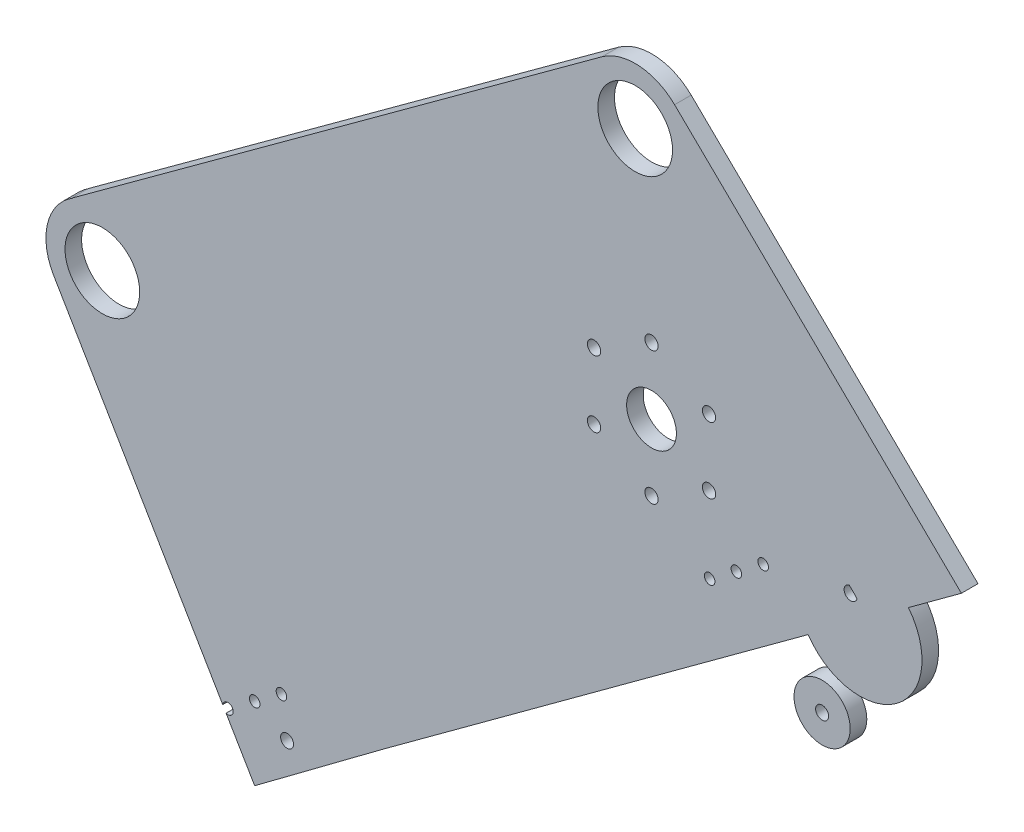
ISO-10303-21;
HEADER;
FILE_DESCRIPTION(('STEP AP214'),'2;1');
FILE_NAME('part.step','',(''),(''),'','','');
FILE_SCHEMA(('AUTOMOTIVE_DESIGN { 1 0 10303 214 1 1 1 1 }'));
ENDSEC;
DATA;
#1=APPLICATION_CONTEXT('core data for automotive mechanical design processes');
#2=APPLICATION_PROTOCOL_DEFINITION('international standard','automotive_design',2000,#1);
#3=PRODUCT_CONTEXT('',#1,'mechanical');
#4=PRODUCT('Part','Part','',(#3));
#5=PRODUCT_RELATED_PRODUCT_CATEGORY('part','',(#4));
#6=PRODUCT_DEFINITION_FORMATION('','',#4);
#7=PRODUCT_DEFINITION_CONTEXT('part definition',#1,'design');
#8=PRODUCT_DEFINITION('design','',#6,#7);
#9=PRODUCT_DEFINITION_SHAPE('','',#8);
#10=(LENGTH_UNIT() NAMED_UNIT(*) SI_UNIT(.MILLI.,.METRE.));
#11=(NAMED_UNIT(*) PLANE_ANGLE_UNIT() SI_UNIT($,.RADIAN.));
#12=(NAMED_UNIT(*) SI_UNIT($,.STERADIAN.) SOLID_ANGLE_UNIT());
#13=UNCERTAINTY_MEASURE_WITH_UNIT(LENGTH_MEASURE(1.E-05),#10,'distance_accuracy_value','');
#14=(GEOMETRIC_REPRESENTATION_CONTEXT(3) GLOBAL_UNCERTAINTY_ASSIGNED_CONTEXT((#13)) GLOBAL_UNIT_ASSIGNED_CONTEXT((#10,
#11,#12)) REPRESENTATION_CONTEXT('',''));
#15=CARTESIAN_POINT('',(0.,0.,0.));
#16=DIRECTION('',(0.,0.,1.));
#17=DIRECTION('',(1.,0.,0.));
#18=AXIS2_PLACEMENT_3D('',#15,#16,#17);
#19=CARTESIAN_POINT('',(-58.0145942928494,79.1007973614675,6.35));
#20=DIRECTION('',(0.591412339888863,-0.80636929767147,0.));
#21=DIRECTION('',(0.806369297671471,0.591412339888863,0.));
#22=AXIS2_PLACEMENT_3D('',#19,#20,#21);
#23=PLANE('',#22);
#24=DIRECTION('',(-0.80636929767147,-0.591412339888863,0.));
#25=VECTOR('',#24,1.);
#26=CARTESIAN_POINT('',(-58.0145942928494,79.1007973614675,0.));
#27=LINE('',#26,#25);
#28=CARTESIAN_POINT('',(175.044488559568,250.032426231912,0.));
#29=VERTEX_POINT('',#28);
#30=CARTESIAN_POINT('',(12.5971113726992,130.889269705091,0.));
#31=VERTEX_POINT('',#30);
#32=EDGE_CURVE('E13',#29,#31,#27,.T.);
#33=ORIENTED_EDGE('',*,*,#32,.F.);
#34=DIRECTION('',(0.,0.,-1.));
#35=VECTOR('',#34,1.);
#36=CARTESIAN_POINT('',(175.044488559568,250.032426231912,6.35));
#37=LINE('',#36,#35);
#38=CARTESIAN_POINT('',(175.044488559568,250.032426231912,6.35));
#39=VERTEX_POINT('',#38);
#40=EDGE_CURVE('E265',#39,#29,#37,.T.);
#41=ORIENTED_EDGE('',*,*,#40,.F.);
#42=DIRECTION('',(-0.80636929767147,-0.591412339888863,0.));
#43=VECTOR('',#42,1.);
#44=CARTESIAN_POINT('',(-58.0145942928494,79.1007973614675,6.35));
#45=LINE('',#44,#43);
#46=CARTESIAN_POINT('',(12.5971113726992,130.889269705091,6.35));
#47=VERTEX_POINT('',#46);
#48=EDGE_CURVE('E143',#39,#47,#45,.T.);
#49=ORIENTED_EDGE('',*,*,#48,.T.);
#50=DIRECTION('',(0.,0.,-1.));
#51=VECTOR('',#50,1.);
#52=CARTESIAN_POINT('',(12.5971113726992,130.889269705091,6.35));
#53=LINE('',#52,#51);
#54=EDGE_CURVE('E294',#47,#31,#53,.T.);
#55=ORIENTED_EDGE('',*,*,#54,.T.);
#56=EDGE_LOOP('',(#33,#41,#49,#55));
#57=FACE_BOUND('',#56,.T.);
#58=ADVANCED_FACE('F139',(#57),#23,.T.);
#59=CARTESIAN_POINT('',(194.801692658245,263.33217195702,6.35));
#60=DIRECTION('',(0.,0.,-1.));
#61=DIRECTION('',(-1.,0.,0.));
#62=AXIS2_PLACEMENT_3D('',#59,#60,#61);
#63=CYLINDRICAL_SURFACE('',#62,23.8165982069088);
#64=CARTESIAN_POINT('',(194.801692658245,263.33217195702,0.));
#65=DIRECTION('',(0.,0.,1.));
#66=DIRECTION('',(1.,0.,0.));
#67=AXIS2_PLACEMENT_3D('',#64,#65,#66);
#68=CIRCLE('',#67,23.8165982069088);
#69=CARTESIAN_POINT('',(213.423210377577,278.180384912724,0.));
#70=VERTEX_POINT('',#69);
#71=EDGE_CURVE('E148',#29,#70,#68,.T.);
#72=ORIENTED_EDGE('',*,*,#71,.T.);
#73=DIRECTION('',(0.,0.,-1.));
#74=VECTOR('',#73,1.);
#75=CARTESIAN_POINT('',(213.423210377577,278.180384912724,6.35));
#76=LINE('',#75,#74);
#77=CARTESIAN_POINT('',(213.423210377577,278.180384912724,6.35));
#78=VERTEX_POINT('',#77);
#79=EDGE_CURVE('E267',#78,#70,#76,.T.);
#80=ORIENTED_EDGE('',*,*,#79,.F.);
#81=CARTESIAN_POINT('',(194.801692658245,263.33217195702,6.35));
#82=DIRECTION('',(0.,0.,1.));
#83=DIRECTION('',(1.,0.,0.));
#84=AXIS2_PLACEMENT_3D('',#81,#82,#83);
#85=CIRCLE('',#84,23.8165982069088);
#86=EDGE_CURVE('E434',#39,#78,#85,.T.);
#87=ORIENTED_EDGE('',*,*,#86,.F.);
#88=ORIENTED_EDGE('',*,*,#40,.T.);
#89=EDGE_LOOP('',(#72,#80,#87,#88));
#90=FACE_BOUND('',#89,.T.);
#91=ADVANCED_FACE('F496',(#90),#63,.T.);
#92=CARTESIAN_POINT('',(233.695993468112,293.048974426554,0.));
#93=VERTEX_POINT('',#92);
#94=EDGE_CURVE('E150',#93,#70,#27,.T.);
#95=ORIENTED_EDGE('',*,*,#94,.F.);
#96=DIRECTION('',(0.,0.,-1.));
#97=VECTOR('',#96,1.);
#98=CARTESIAN_POINT('',(233.695993468112,293.048974426554,6.35));
#99=LINE('',#98,#97);
#100=CARTESIAN_POINT('',(233.695993468112,293.048974426554,6.35));
#101=VERTEX_POINT('',#100);
#102=EDGE_CURVE('E269',#101,#93,#99,.T.);
#103=ORIENTED_EDGE('',*,*,#102,.F.);
#104=EDGE_CURVE('E433',#101,#78,#45,.T.);
#105=ORIENTED_EDGE('',*,*,#104,.T.);
#106=ORIENTED_EDGE('',*,*,#79,.T.);
#107=EDGE_LOOP('',(#95,#103,#105,#106));
#108=FACE_BOUND('',#107,.T.);
#109=ADVANCED_FACE('F443',(#108),#23,.T.);
#110=CARTESIAN_POINT('',(260.40904857053,266.99483248331,6.35));
#111=DIRECTION('',(0.698222581301587,0.715880735151148,0.));
#112=DIRECTION('',(-0.715880735151148,0.698222581301587,0.));
#113=AXIS2_PLACEMENT_3D('',#110,#111,#112);
#114=PLANE('',#113);
#115=DIRECTION('',(0.715880735151148,-0.698222581301587,0.));
#116=VECTOR('',#115,1.);
#117=CARTESIAN_POINT('',(260.40904857053,266.99483248331,0.));
#118=LINE('',#117,#116);
#119=CARTESIAN_POINT('',(123.939892902666,400.097794275326,0.));
#120=VERTEX_POINT('',#119);
#121=EDGE_CURVE('E363',#120,#93,#118,.T.);
#122=ORIENTED_EDGE('',*,*,#121,.F.);
#123=DIRECTION('',(0.,0.,-1.));
#124=VECTOR('',#123,1.);
#125=CARTESIAN_POINT('',(123.939892902666,400.097794275326,6.35));
#126=LINE('',#125,#124);
#127=CARTESIAN_POINT('',(123.939892902666,400.097794275326,6.35));
#128=VERTEX_POINT('',#127);
#129=EDGE_CURVE('E271',#128,#120,#126,.T.);
#130=ORIENTED_EDGE('',*,*,#129,.F.);
#131=DIRECTION('',(0.715880735151148,-0.698222581301587,0.));
#132=VECTOR('',#131,1.);
#133=CARTESIAN_POINT('',(260.40904857053,266.99483248331,6.35));
#134=LINE('',#133,#132);
#135=EDGE_CURVE('E431',#128,#101,#134,.T.);
#136=ORIENTED_EDGE('',*,*,#135,.T.);
#137=ORIENTED_EDGE('',*,*,#102,.T.);
#138=EDGE_LOOP('',(#122,#130,#136,#137));
#139=FACE_BOUND('',#138,.T.);
#140=ADVANCED_FACE('F448',(#139),#114,.T.);
#141=CARTESIAN_POINT('',(108.865267372365,384.641929203413,6.35));
#142=DIRECTION('',(0.,0.,-1.));
#143=DIRECTION('',(-1.,0.,0.));
#144=AXIS2_PLACEMENT_3D('',#141,#142,#143);
#145=CYLINDRICAL_SURFACE('',#144,21.5899999999999);
#146=CARTESIAN_POINT('',(108.865267372365,384.641929203413,0.));
#147=DIRECTION('',(0.,0.,1.));
#148=DIRECTION('',(1.,0.,0.));
#149=AXIS2_PLACEMENT_3D('',#146,#147,#148);
#150=CIRCLE('',#149,21.5899999999999);
#151=CARTESIAN_POINT('',(96.1250627386689,402.072227132351,0.));
#152=VERTEX_POINT('',#151);
#153=EDGE_CURVE('E361',#120,#152,#150,.T.);
#154=ORIENTED_EDGE('',*,*,#153,.T.);
#155=DIRECTION('',(0.,0.,-1.));
#156=VECTOR('',#155,1.);
#157=CARTESIAN_POINT('',(96.1250627386689,402.072227132351,6.35));
#158=LINE('',#157,#156);
#159=CARTESIAN_POINT('',(96.1250627386689,402.072227132351,6.35));
#160=VERTEX_POINT('',#159);
#161=EDGE_CURVE('E273',#160,#152,#158,.T.);
#162=ORIENTED_EDGE('',*,*,#161,.F.);
#163=CARTESIAN_POINT('',(108.865267372365,384.641929203413,6.35));
#164=DIRECTION('',(0.,0.,1.));
#165=DIRECTION('',(1.,0.,0.));
#166=AXIS2_PLACEMENT_3D('',#163,#164,#165);
#167=CIRCLE('',#166,21.5899999999999);
#168=EDGE_CURVE('E429',#128,#160,#167,.T.);
#169=ORIENTED_EDGE('',*,*,#168,.F.);
#170=ORIENTED_EDGE('',*,*,#129,.T.);
#171=EDGE_LOOP('',(#154,#162,#169,#170));
#172=FACE_BOUND('',#171,.T.);
#173=ADVANCED_FACE('F453',(#172),#145,.T.);
#174=CARTESIAN_POINT('',(-158.076858744562,216.270210943149,6.35));
#175=DIRECTION('',(0.590097481875696,-0.807332002266702,0.));
#176=DIRECTION('',(0.807332002266702,0.590097481875696,0.));
#177=AXIS2_PLACEMENT_3D('',#174,#175,#176);
#178=PLANE('',#177);
#179=DIRECTION('',(-0.807332002266702,-0.590097481875696,0.));
#180=VECTOR('',#179,1.);
#181=CARTESIAN_POINT('',(-158.076858744562,216.270210943149,0.));
#182=LINE('',#181,#180);
#183=CARTESIAN_POINT('',(-106.905210068869,253.672742915342,0.));
#184=VERTEX_POINT('',#183);
#185=EDGE_CURVE('E359',#152,#184,#182,.T.);
#186=ORIENTED_EDGE('',*,*,#185,.T.);
#187=DIRECTION('',(0.,0.,-1.));
#188=VECTOR('',#187,1.);
#189=CARTESIAN_POINT('',(-106.905210068869,253.672742915342,6.35));
#190=LINE('',#189,#188);
#191=CARTESIAN_POINT('',(-106.905210068869,253.672742915342,6.35));
#192=VERTEX_POINT('',#191);
#193=EDGE_CURVE('E276',#192,#184,#190,.T.);
#194=ORIENTED_EDGE('',*,*,#193,.F.);
#195=DIRECTION('',(-0.807332002266702,-0.590097481875696,0.));
#196=VECTOR('',#195,1.);
#197=CARTESIAN_POINT('',(-158.076858744562,216.270210943149,6.35));
#198=LINE('',#197,#196);
#199=EDGE_CURVE('E427',#160,#192,#198,.T.);
#200=ORIENTED_EDGE('',*,*,#199,.F.);
#201=ORIENTED_EDGE('',*,*,#161,.T.);
#202=EDGE_LOOP('',(#186,#194,#200,#201));
#203=FACE_BOUND('',#202,.T.);
#204=ADVANCED_FACE('F459',(#203),#178,.F.);
#205=CARTESIAN_POINT('',(-138.221651335503,235.274625310833,6.35));
#206=DIRECTION('',(-0.506543079409337,0.862214653495581,0.));
#207=DIRECTION('',(-0.862214653495582,-0.506543079409337,0.));
#208=AXIS2_PLACEMENT_3D('',#205,#206,#207);
#209=PLANE('',#208);
#210=DIRECTION('',(0.862214653495582,0.506543079409337,0.));
#211=VECTOR('',#210,1.);
#212=CARTESIAN_POINT('',(-138.221651335503,235.274625310833,0.));
#213=LINE('',#212,#211);
#214=CARTESIAN_POINT('',(-105.973590034164,254.220061009863,0.));
#215=VERTEX_POINT('',#214);
#216=EDGE_CURVE('E357',#184,#215,#213,.T.);
#217=ORIENTED_EDGE('',*,*,#216,.T.);
#218=DIRECTION('',(0.,0.,-1.));
#219=VECTOR('',#218,1.);
#220=CARTESIAN_POINT('',(-105.973590034164,254.220061009863,6.35));
#221=LINE('',#220,#219);
#222=CARTESIAN_POINT('',(-105.973590034164,254.220061009863,6.35));
#223=VERTEX_POINT('',#222);
#224=EDGE_CURVE('E279',#223,#215,#221,.T.);
#225=ORIENTED_EDGE('',*,*,#224,.F.);
#226=DIRECTION('',(0.862214653495582,0.506543079409337,0.));
#227=VECTOR('',#226,1.);
#228=CARTESIAN_POINT('',(-138.221651335503,235.274625310833,6.35));
#229=LINE('',#228,#227);
#230=EDGE_CURVE('E425',#192,#223,#229,.T.);
#231=ORIENTED_EDGE('',*,*,#230,.F.);
#232=ORIENTED_EDGE('',*,*,#193,.T.);
#233=EDGE_LOOP('',(#217,#225,#231,#232));
#234=FACE_BOUND('',#233,.T.);
#235=ADVANCED_FACE('F463',(#234),#209,.F.);
#236=CARTESIAN_POINT('',(-95.037324949716,235.604846640893,6.35));
#237=DIRECTION('',(0.,0.,-1.));
#238=DIRECTION('',(-1.,0.,0.));
#239=AXIS2_PLACEMENT_3D('',#236,#237,#238);
#240=CYLINDRICAL_SURFACE('',#239,21.59);
#241=CARTESIAN_POINT('',(-95.037324949716,235.604846640893,0.));
#242=DIRECTION('',(0.,0.,1.));
#243=DIRECTION('',(1.,0.,0.));
#244=AXIS2_PLACEMENT_3D('',#241,#242,#243);
#245=CIRCLE('',#244,21.59);
#246=CARTESIAN_POINT('',(-113.642415099352,224.651366804607,0.));
#247=VERTEX_POINT('',#246);
#248=EDGE_CURVE('E355',#215,#247,#245,.T.);
#249=ORIENTED_EDGE('',*,*,#248,.T.);
#250=DIRECTION('',(0.,0.,-1.));
#251=VECTOR('',#250,1.);
#252=CARTESIAN_POINT('',(-113.642415099352,224.651366804607,6.35));
#253=LINE('',#252,#251);
#254=CARTESIAN_POINT('',(-113.642415099352,224.651366804607,6.35));
#255=VERTEX_POINT('',#254);
#256=EDGE_CURVE('E282',#255,#247,#253,.T.);
#257=ORIENTED_EDGE('',*,*,#256,.F.);
#258=CARTESIAN_POINT('',(-95.037324949716,235.604846640893,6.35));
#259=DIRECTION('',(0.,0.,1.));
#260=DIRECTION('',(1.,0.,0.));
#261=AXIS2_PLACEMENT_3D('',#258,#259,#260);
#262=CIRCLE('',#261,21.59);
#263=EDGE_CURVE('E423',#223,#255,#262,.T.);
#264=ORIENTED_EDGE('',*,*,#263,.F.);
#265=ORIENTED_EDGE('',*,*,#224,.T.);
#266=EDGE_LOOP('',(#249,#257,#264,#265));
#267=FACE_BOUND('',#266,.T.);
#268=ADVANCED_FACE('F468',(#267),#240,.T.);
#269=CARTESIAN_POINT('',(13.825723790201,8.13969647768593,6.35));
#270=DIRECTION('',(0.861745722539881,0.507340427803875,0.));
#271=DIRECTION('',(-0.507340427803875,0.861745722539881,0.));
#272=AXIS2_PLACEMENT_3D('',#269,#270,#271);
#273=PLANE('',#272);
#274=DIRECTION('',(0.507340427803875,-0.861745722539881,0.));
#275=VECTOR('',#274,1.);
#276=CARTESIAN_POINT('',(13.825723790201,8.13969647768593,0.));
#277=LINE('',#276,#275);
#278=CARTESIAN_POINT('',(-48.9802173461725,114.819054475318,0.));
#279=VERTEX_POINT('',#278);
#280=EDGE_CURVE('E352',#247,#279,#277,.T.);
#281=ORIENTED_EDGE('',*,*,#280,.T.);
#282=DIRECTION('',(0.,0.,-1.));
#283=VECTOR('',#282,1.);
#284=CARTESIAN_POINT('',(-48.9802173461725,114.819054475318,6.35));
#285=LINE('',#284,#283);
#286=CARTESIAN_POINT('',(-48.9802173461725,114.819054475318,6.35));
#287=VERTEX_POINT('',#286);
#288=EDGE_CURVE('E285',#287,#279,#285,.T.);
#289=ORIENTED_EDGE('',*,*,#288,.F.);
#290=DIRECTION('',(0.507340427803875,-0.861745722539881,0.));
#291=VECTOR('',#290,1.);
#292=CARTESIAN_POINT('',(13.825723790201,8.13969647768593,6.35));
#293=LINE('',#292,#291);
#294=EDGE_CURVE('E421',#255,#287,#293,.T.);
#295=ORIENTED_EDGE('',*,*,#294,.F.);
#296=ORIENTED_EDGE('',*,*,#256,.T.);
#297=EDGE_LOOP('',(#281,#289,#295,#296));
#298=FACE_BOUND('',#297,.T.);
#299=ADVANCED_FACE('F473',(#298),#273,.F.);
#300=CARTESIAN_POINT('',(-46.9839153268576,114.515161833616,6.35));
#301=DIRECTION('',(0.,0.,-1.));
#302=DIRECTION('',(-1.,0.,0.));
#303=AXIS2_PLACEMENT_3D('',#300,#301,#302);
#304=CYLINDRICAL_SURFACE('',#303,2.01930000000035);
#305=CARTESIAN_POINT('',(-46.9839153268576,114.515161833616,0.));
#306=DIRECTION('',(0.,0.,1.));
#307=DIRECTION('',(1.,0.,0.));
#308=AXIS2_PLACEMENT_3D('',#305,#306,#307);
#309=CIRCLE('',#308,2.01930000000035);
#310=CARTESIAN_POINT('',(-47.6868210059015,112.622149394046,0.));
#311=VERTEX_POINT('',#310);
#312=EDGE_CURVE('E349',#311,#279,#309,.T.);
#313=ORIENTED_EDGE('',*,*,#312,.F.);
#314=DIRECTION('',(0.,0.,-1.));
#315=VECTOR('',#314,1.);
#316=CARTESIAN_POINT('',(-47.6868210059015,112.622149394046,6.35));
#317=LINE('',#316,#315);
#318=CARTESIAN_POINT('',(-47.6868210059015,112.622149394046,6.35));
#319=VERTEX_POINT('',#318);
#320=EDGE_CURVE('E287',#319,#311,#317,.T.);
#321=ORIENTED_EDGE('',*,*,#320,.F.);
#322=CARTESIAN_POINT('',(-46.9839153268576,114.515161833616,6.35));
#323=DIRECTION('',(0.,0.,1.));
#324=DIRECTION('',(1.,0.,0.));
#325=AXIS2_PLACEMENT_3D('',#322,#323,#324);
#326=CIRCLE('',#325,2.01930000000035);
#327=EDGE_CURVE('E418',#319,#287,#326,.T.);
#328=ORIENTED_EDGE('',*,*,#327,.T.);
#329=ORIENTED_EDGE('',*,*,#288,.T.);
#330=EDGE_LOOP('',(#313,#321,#328,#329));
#331=FACE_BOUND('',#330,.T.);
#332=ADVANCED_FACE('F477',(#331),#304,.F.);
#333=CARTESIAN_POINT('',(-36.7497037716635,94.0448520272265,0.));
#334=VERTEX_POINT('',#333);
#335=EDGE_CURVE('E348',#311,#334,#277,.T.);
#336=ORIENTED_EDGE('',*,*,#335,.T.);
#337=DIRECTION('',(0.,0.,-1.));
#338=VECTOR('',#337,1.);
#339=CARTESIAN_POINT('',(-36.7497037716635,94.0448520272265,6.35));
#340=LINE('',#339,#338);
#341=CARTESIAN_POINT('',(-36.7497037716635,94.0448520272265,6.35));
#342=VERTEX_POINT('',#341);
#343=EDGE_CURVE('E289',#342,#334,#340,.T.);
#344=ORIENTED_EDGE('',*,*,#343,.F.);
#345=EDGE_CURVE('E417',#319,#342,#293,.T.);
#346=ORIENTED_EDGE('',*,*,#345,.F.);
#347=ORIENTED_EDGE('',*,*,#320,.T.);
#348=EDGE_LOOP('',(#336,#344,#346,#347));
#349=FACE_BOUND('',#348,.T.);
#350=ADVANCED_FACE('F482',(#349),#273,.F.);
#351=CARTESIAN_POINT('',(-58.2396300255187,77.9989202294783,6.35));
#352=DIRECTION('',(-0.59829210989985,0.801278073599662,0.));
#353=DIRECTION('',(-0.801278073599662,-0.59829210989985,0.));
#354=AXIS2_PLACEMENT_3D('',#351,#352,#353);
#355=PLANE('',#354);
#356=DIRECTION('',(0.801278073599662,0.59829210989985,0.));
#357=VECTOR('',#356,1.);
#358=CARTESIAN_POINT('',(-58.2396300255187,77.9989202294783,0.));
#359=LINE('',#358,#357);
#360=CARTESIAN_POINT('',(12.3743100208932,130.724390413525,0.));
#361=VERTEX_POINT('',#360);
#362=EDGE_CURVE('E345',#334,#361,#359,.T.);
#363=ORIENTED_EDGE('',*,*,#362,.T.);
#364=DIRECTION('',(0.,0.,-1.));
#365=VECTOR('',#364,1.);
#366=CARTESIAN_POINT('',(12.3743100208932,130.724390413525,6.35));
#367=LINE('',#366,#365);
#368=CARTESIAN_POINT('',(12.3743100208932,130.724390413525,6.35));
#369=VERTEX_POINT('',#368);
#370=EDGE_CURVE('E292',#369,#361,#367,.T.);
#371=ORIENTED_EDGE('',*,*,#370,.F.);
#372=DIRECTION('',(0.801278073599662,0.59829210989985,0.));
#373=VECTOR('',#372,1.);
#374=CARTESIAN_POINT('',(-58.2396300255187,77.9989202294783,6.35));
#375=LINE('',#374,#373);
#376=EDGE_CURVE('E415',#342,#369,#375,.T.);
#377=ORIENTED_EDGE('',*,*,#376,.F.);
#378=ORIENTED_EDGE('',*,*,#343,.T.);
#379=EDGE_LOOP('',(#363,#371,#377,#378));
#380=FACE_BOUND('',#379,.T.);
#381=ADVANCED_FACE('F487',(#380),#355,.F.);
#382=CARTESIAN_POINT('',(-95.037324949716,235.604846640893,6.35));
#383=DIRECTION('',(0.,0.,-1.));
#384=DIRECTION('',(-1.,0.,0.));
#385=AXIS2_PLACEMENT_3D('',#382,#383,#384);
#386=CYLINDRICAL_SURFACE('',#385,14.2874999999999);
#387=CARTESIAN_POINT('',(-95.037324949716,235.604846640893,6.35));
#388=DIRECTION('',(0.,0.,1.));
#389=DIRECTION('',(1.,0.,0.));
#390=AXIS2_PLACEMENT_3D('',#387,#388,#389);
#391=CIRCLE('',#390,14.2874999999999);
#392=CARTESIAN_POINT('',(-80.7498249497161,235.604846640893,6.35));
#393=VERTEX_POINT('',#392);
#394=EDGE_CURVE('E370',#393,#393,#391,.T.);
#395=ORIENTED_EDGE('',*,*,#394,.T.);
#396=EDGE_LOOP('',(#395));
#397=FACE_BOUND('',#396,.T.);
#398=CARTESIAN_POINT('',(-95.037324949716,235.604846640893,0.));
#399=DIRECTION('',(0.,0.,1.));
#400=DIRECTION('',(1.,0.,0.));
#401=AXIS2_PLACEMENT_3D('',#398,#399,#400);
#402=CIRCLE('',#401,14.2874999999999);
#403=CARTESIAN_POINT('',(-80.7498249497161,235.604846640893,0.));
#404=VERTEX_POINT('',#403);
#405=EDGE_CURVE('E300',#404,#404,#402,.T.);
#406=ORIENTED_EDGE('',*,*,#405,.F.);
#407=EDGE_LOOP('',(#406));
#408=FACE_BOUND('',#407,.T.);
#409=ADVANCED_FACE('F571',(#397,#408),#386,.F.);
#410=CARTESIAN_POINT('',(-24.3503664231861,115.175606008639,6.35));
#411=DIRECTION('',(0.,0.,-1.));
#412=DIRECTION('',(-1.,0.,0.));
#413=AXIS2_PLACEMENT_3D('',#410,#411,#412);
#414=CYLINDRICAL_SURFACE('',#413,2.4892);
#415=CARTESIAN_POINT('',(-24.3503664231861,115.175606008639,6.35));
#416=DIRECTION('',(0.,0.,1.));
#417=DIRECTION('',(1.,0.,0.));
#418=AXIS2_PLACEMENT_3D('',#415,#416,#417);
#419=CIRCLE('',#418,2.4892);
#420=CARTESIAN_POINT('',(-21.8611664231861,115.175606008639,6.35));
#421=VERTEX_POINT('',#420);
#422=EDGE_CURVE('E373',#421,#421,#419,.T.);
#423=ORIENTED_EDGE('',*,*,#422,.T.);
#424=EDGE_LOOP('',(#423));
#425=FACE_BOUND('',#424,.T.);
#426=CARTESIAN_POINT('',(-24.3503664231861,115.175606008639,0.));
#427=DIRECTION('',(0.,0.,1.));
#428=DIRECTION('',(1.,0.,0.));
#429=AXIS2_PLACEMENT_3D('',#426,#427,#428);
#430=CIRCLE('',#429,2.4892);
#431=CARTESIAN_POINT('',(-21.8611664231861,115.175606008639,0.));
#432=VERTEX_POINT('',#431);
#433=EDGE_CURVE('E303',#432,#432,#430,.T.);
#434=ORIENTED_EDGE('',*,*,#433,.F.);
#435=EDGE_LOOP('',(#434));
#436=FACE_BOUND('',#435,.T.);
#437=ADVANCED_FACE('F619',(#425,#436),#414,.F.);
#438=CARTESIAN_POINT('',(157.833886281696,264.733896165387,6.35));
#439=DIRECTION('',(0.,0.,-1.));
#440=DIRECTION('',(-1.,0.,0.));
#441=AXIS2_PLACEMENT_3D('',#438,#439,#440);
#442=CYLINDRICAL_SURFACE('',#441,2.01929999999998);
#443=CARTESIAN_POINT('',(157.833886281696,264.733896165387,6.35));
#444=DIRECTION('',(0.,0.,1.));
#445=DIRECTION('',(1.,0.,0.));
#446=AXIS2_PLACEMENT_3D('',#443,#444,#445);
#447=CIRCLE('',#446,2.01929999999998);
#448=CARTESIAN_POINT('',(159.853186281696,264.733896165387,6.35));
#449=VERTEX_POINT('',#448);
#450=EDGE_CURVE('E376',#449,#449,#447,.T.);
#451=ORIENTED_EDGE('',*,*,#450,.T.);
#452=EDGE_LOOP('',(#451));
#453=FACE_BOUND('',#452,.T.);
#454=CARTESIAN_POINT('',(157.833886281696,264.733896165387,0.));
#455=DIRECTION('',(0.,0.,1.));
#456=DIRECTION('',(1.,0.,0.));
#457=AXIS2_PLACEMENT_3D('',#454,#455,#456);
#458=CIRCLE('',#457,2.01929999999998);
#459=CARTESIAN_POINT('',(159.853186281696,264.733896165387,0.));
#460=VERTEX_POINT('',#459);
#461=EDGE_CURVE('E306',#460,#460,#458,.T.);
#462=ORIENTED_EDGE('',*,*,#461,.F.);
#463=EDGE_LOOP('',(#462));
#464=FACE_BOUND('',#463,.T.);
#465=ADVANCED_FACE('F615',(#453,#464),#442,.F.);
#466=CARTESIAN_POINT('',(147.592996201268,257.222959448799,6.35));
#467=DIRECTION('',(0.,0.,-1.));
#468=DIRECTION('',(-1.,0.,0.));
#469=AXIS2_PLACEMENT_3D('',#466,#467,#468);
#470=CYLINDRICAL_SURFACE('',#469,2.01929999999982);
#471=CARTESIAN_POINT('',(147.592996201268,257.222959448799,6.35));
#472=DIRECTION('',(0.,0.,1.));
#473=DIRECTION('',(1.,0.,0.));
#474=AXIS2_PLACEMENT_3D('',#471,#472,#473);
#475=CIRCLE('',#474,2.01929999999982);
#476=CARTESIAN_POINT('',(149.612296201268,257.222959448799,6.35));
#477=VERTEX_POINT('',#476);
#478=EDGE_CURVE('E379',#477,#477,#475,.T.);
#479=ORIENTED_EDGE('',*,*,#478,.T.);
#480=EDGE_LOOP('',(#479));
#481=FACE_BOUND('',#480,.T.);
#482=CARTESIAN_POINT('',(147.592996201268,257.222959448799,0.));
#483=DIRECTION('',(0.,0.,1.));
#484=DIRECTION('',(1.,0.,0.));
#485=AXIS2_PLACEMENT_3D('',#482,#483,#484);
#486=CIRCLE('',#485,2.01929999999982);
#487=CARTESIAN_POINT('',(149.612296201268,257.222959448799,0.));
#488=VERTEX_POINT('',#487);
#489=EDGE_CURVE('E309',#488,#488,#486,.T.);
#490=ORIENTED_EDGE('',*,*,#489,.F.);
#491=EDGE_LOOP('',(#490));
#492=FACE_BOUND('',#491,.T.);
#493=ADVANCED_FACE('F611',(#481,#492),#470,.F.);
#494=CARTESIAN_POINT('',(137.352106120841,249.71202273221,6.35));
#495=DIRECTION('',(0.,0.,-1.));
#496=DIRECTION('',(-1.,0.,0.));
#497=AXIS2_PLACEMENT_3D('',#494,#495,#496);
#498=CYLINDRICAL_SURFACE('',#497,2.01929999999972);
#499=CARTESIAN_POINT('',(137.352106120841,249.71202273221,6.35));
#500=DIRECTION('',(0.,0.,1.));
#501=DIRECTION('',(1.,0.,0.));
#502=AXIS2_PLACEMENT_3D('',#499,#500,#501);
#503=CIRCLE('',#502,2.01929999999972);
#504=CARTESIAN_POINT('',(139.37140612084,249.71202273221,6.35));
#505=VERTEX_POINT('',#504);
#506=EDGE_CURVE('E382',#505,#505,#503,.T.);
#507=ORIENTED_EDGE('',*,*,#506,.T.);
#508=EDGE_LOOP('',(#507));
#509=FACE_BOUND('',#508,.T.);
#510=CARTESIAN_POINT('',(137.352106120841,249.71202273221,0.));
#511=DIRECTION('',(0.,0.,1.));
#512=DIRECTION('',(1.,0.,0.));
#513=AXIS2_PLACEMENT_3D('',#510,#511,#512);
#514=CIRCLE('',#513,2.01929999999972);
#515=CARTESIAN_POINT('',(139.37140612084,249.71202273221,0.));
#516=VERTEX_POINT('',#515);
#517=EDGE_CURVE('E312',#516,#516,#514,.T.);
#518=ORIENTED_EDGE('',*,*,#517,.F.);
#519=EDGE_LOOP('',(#518));
#520=FACE_BOUND('',#519,.T.);
#521=ADVANCED_FACE('F607',(#509,#520),#498,.F.);
#522=CARTESIAN_POINT('',(-26.5021351660023,129.537035266793,6.35));
#523=DIRECTION('',(0.,0.,-1.));
#524=DIRECTION('',(-1.,0.,0.));
#525=AXIS2_PLACEMENT_3D('',#522,#523,#524);
#526=CYLINDRICAL_SURFACE('',#525,2.01930000000003);
#527=CARTESIAN_POINT('',(-26.5021351660023,129.537035266793,6.35));
#528=DIRECTION('',(0.,0.,1.));
#529=DIRECTION('',(1.,0.,0.));
#530=AXIS2_PLACEMENT_3D('',#527,#528,#529);
#531=CIRCLE('',#530,2.01930000000003);
#532=CARTESIAN_POINT('',(-24.4828351660022,129.537035266793,6.35));
#533=VERTEX_POINT('',#532);
#534=EDGE_CURVE('E385',#533,#533,#531,.T.);
#535=ORIENTED_EDGE('',*,*,#534,.T.);
#536=EDGE_LOOP('',(#535));
#537=FACE_BOUND('',#536,.T.);
#538=CARTESIAN_POINT('',(-26.5021351660023,129.537035266793,0.));
#539=DIRECTION('',(0.,0.,1.));
#540=DIRECTION('',(1.,0.,0.));
#541=AXIS2_PLACEMENT_3D('',#538,#539,#540);
#542=CIRCLE('',#541,2.01930000000003);
#543=CARTESIAN_POINT('',(-24.4828351660022,129.537035266793,0.));
#544=VERTEX_POINT('',#543);
#545=EDGE_CURVE('E315',#544,#544,#542,.T.);
#546=ORIENTED_EDGE('',*,*,#545,.F.);
#547=EDGE_LOOP('',(#546));
#548=FACE_BOUND('',#547,.T.);
#549=ADVANCED_FACE('F603',(#537,#548),#526,.F.);
#550=CARTESIAN_POINT('',(-36.7430252464299,122.026098550205,6.35));
#551=DIRECTION('',(0.,0.,-1.));
#552=DIRECTION('',(-1.,0.,0.));
#553=AXIS2_PLACEMENT_3D('',#550,#551,#552);
#554=CYLINDRICAL_SURFACE('',#553,2.01930000000035);
#555=CARTESIAN_POINT('',(-36.7430252464299,122.026098550205,6.35));
#556=DIRECTION('',(0.,0.,1.));
#557=DIRECTION('',(1.,0.,0.));
#558=AXIS2_PLACEMENT_3D('',#555,#556,#557);
#559=CIRCLE('',#558,2.01930000000035);
#560=CARTESIAN_POINT('',(-34.7237252464296,122.026098550205,6.35));
#561=VERTEX_POINT('',#560);
#562=EDGE_CURVE('E388',#561,#561,#559,.T.);
#563=ORIENTED_EDGE('',*,*,#562,.T.);
#564=EDGE_LOOP('',(#563));
#565=FACE_BOUND('',#564,.T.);
#566=CARTESIAN_POINT('',(-36.7430252464299,122.026098550205,0.));
#567=DIRECTION('',(0.,0.,1.));
#568=DIRECTION('',(1.,0.,0.));
#569=AXIS2_PLACEMENT_3D('',#566,#567,#568);
#570=CIRCLE('',#569,2.01930000000035);
#571=CARTESIAN_POINT('',(-34.7237252464296,122.026098550205,0.));
#572=VERTEX_POINT('',#571);
#573=EDGE_CURVE('E318',#572,#572,#570,.T.);
#574=ORIENTED_EDGE('',*,*,#573,.F.);
#575=EDGE_LOOP('',(#574));
#576=FACE_BOUND('',#575,.T.);
#577=ADVANCED_FACE('F599',(#565,#576),#554,.F.);
#578=CARTESIAN_POINT('',(115.109334590485,316.863814510386,6.35));
#579=DIRECTION('',(0.,0.,-1.));
#580=DIRECTION('',(-1.,0.,0.));
#581=AXIS2_PLACEMENT_3D('',#578,#579,#580);
#582=CYLINDRICAL_SURFACE('',#581,2.53999999999998);
#583=CARTESIAN_POINT('',(115.109334590485,316.863814510386,6.35));
#584=DIRECTION('',(0.,0.,1.));
#585=DIRECTION('',(1.,0.,0.));
#586=AXIS2_PLACEMENT_3D('',#583,#584,#585);
#587=CIRCLE('',#586,2.53999999999998);
#588=CARTESIAN_POINT('',(117.649334590485,316.863814510386,6.35));
#589=VERTEX_POINT('',#588);
#590=EDGE_CURVE('E391',#589,#589,#587,.T.);
#591=ORIENTED_EDGE('',*,*,#590,.T.);
#592=EDGE_LOOP('',(#591));
#593=FACE_BOUND('',#592,.T.);
#594=CARTESIAN_POINT('',(115.109334590485,316.863814510386,0.));
#595=DIRECTION('',(0.,0.,1.));
#596=DIRECTION('',(1.,0.,0.));
#597=AXIS2_PLACEMENT_3D('',#594,#595,#596);
#598=CIRCLE('',#597,2.53999999999998);
#599=CARTESIAN_POINT('',(117.649334590485,316.863814510386,0.));
#600=VERTEX_POINT('',#599);
#601=EDGE_CURVE('E321',#600,#600,#598,.T.);
#602=ORIENTED_EDGE('',*,*,#601,.F.);
#603=EDGE_LOOP('',(#602));
#604=FACE_BOUND('',#603,.T.);
#605=ADVANCED_FACE('F595',(#593,#604),#582,.F.);
#606=CARTESIAN_POINT('',(137.10637984661,304.163814510385,6.35));
#607=DIRECTION('',(0.,0.,-1.));
#608=DIRECTION('',(-1.,0.,0.));
#609=AXIS2_PLACEMENT_3D('',#606,#607,#608);
#610=CYLINDRICAL_SURFACE('',#609,2.53999999999998);
#611=CARTESIAN_POINT('',(137.10637984661,304.163814510385,6.35));
#612=DIRECTION('',(0.,0.,1.));
#613=DIRECTION('',(1.,0.,0.));
#614=AXIS2_PLACEMENT_3D('',#611,#612,#613);
#615=CIRCLE('',#614,2.53999999999998);
#616=CARTESIAN_POINT('',(139.64637984661,304.163814510385,6.35));
#617=VERTEX_POINT('',#616);
#618=EDGE_CURVE('E394',#617,#617,#615,.T.);
#619=ORIENTED_EDGE('',*,*,#618,.T.);
#620=EDGE_LOOP('',(#619));
#621=FACE_BOUND('',#620,.T.);
#622=CARTESIAN_POINT('',(137.10637984661,304.163814510385,0.));
#623=DIRECTION('',(0.,0.,1.));
#624=DIRECTION('',(1.,0.,0.));
#625=AXIS2_PLACEMENT_3D('',#622,#623,#624);
#626=CIRCLE('',#625,2.53999999999998);
#627=CARTESIAN_POINT('',(139.64637984661,304.163814510385,0.));
#628=VERTEX_POINT('',#627);
#629=EDGE_CURVE('E324',#628,#628,#626,.T.);
#630=ORIENTED_EDGE('',*,*,#629,.F.);
#631=EDGE_LOOP('',(#630));
#632=FACE_BOUND('',#631,.T.);
#633=ADVANCED_FACE('F591',(#621,#632),#610,.F.);
#634=CARTESIAN_POINT('',(137.106379846609,278.763814510386,6.35));
#635=DIRECTION('',(0.,0.,-1.));
#636=DIRECTION('',(-1.,0.,0.));
#637=AXIS2_PLACEMENT_3D('',#634,#635,#636);
#638=CYLINDRICAL_SURFACE('',#637,2.53999999999996);
#639=CARTESIAN_POINT('',(137.106379846609,278.763814510386,6.35));
#640=DIRECTION('',(0.,0.,1.));
#641=DIRECTION('',(1.,0.,0.));
#642=AXIS2_PLACEMENT_3D('',#639,#640,#641);
#643=CIRCLE('',#642,2.53999999999996);
#644=CARTESIAN_POINT('',(139.646379846609,278.763814510386,6.35));
#645=VERTEX_POINT('',#644);
#646=EDGE_CURVE('E397',#645,#645,#643,.T.);
#647=ORIENTED_EDGE('',*,*,#646,.T.);
#648=EDGE_LOOP('',(#647));
#649=FACE_BOUND('',#648,.T.);
#650=CARTESIAN_POINT('',(137.106379846609,278.763814510386,0.));
#651=DIRECTION('',(0.,0.,1.));
#652=DIRECTION('',(1.,0.,0.));
#653=AXIS2_PLACEMENT_3D('',#650,#651,#652);
#654=CIRCLE('',#653,2.53999999999996);
#655=CARTESIAN_POINT('',(139.646379846609,278.763814510386,0.));
#656=VERTEX_POINT('',#655);
#657=EDGE_CURVE('E327',#656,#656,#654,.T.);
#658=ORIENTED_EDGE('',*,*,#657,.F.);
#659=EDGE_LOOP('',(#658));
#660=FACE_BOUND('',#659,.T.);
#661=ADVANCED_FACE('F587',(#649,#660),#638,.F.);
#662=CARTESIAN_POINT('',(115.109334590484,266.063814510386,6.35));
#663=DIRECTION('',(0.,0.,-1.));
#664=DIRECTION('',(-1.,0.,0.));
#665=AXIS2_PLACEMENT_3D('',#662,#663,#664);
#666=CYLINDRICAL_SURFACE('',#665,2.54000000000001);
#667=CARTESIAN_POINT('',(115.109334590484,266.063814510386,6.35));
#668=DIRECTION('',(0.,0.,1.));
#669=DIRECTION('',(1.,0.,0.));
#670=AXIS2_PLACEMENT_3D('',#667,#668,#669);
#671=CIRCLE('',#670,2.54000000000001);
#672=CARTESIAN_POINT('',(117.649334590484,266.063814510386,6.35));
#673=VERTEX_POINT('',#672);
#674=EDGE_CURVE('E400',#673,#673,#671,.T.);
#675=ORIENTED_EDGE('',*,*,#674,.T.);
#676=EDGE_LOOP('',(#675));
#677=FACE_BOUND('',#676,.T.);
#678=CARTESIAN_POINT('',(115.109334590484,266.063814510386,0.));
#679=DIRECTION('',(0.,0.,1.));
#680=DIRECTION('',(1.,0.,0.));
#681=AXIS2_PLACEMENT_3D('',#678,#679,#680);
#682=CIRCLE('',#681,2.54000000000001);
#683=CARTESIAN_POINT('',(117.649334590484,266.063814510386,0.));
#684=VERTEX_POINT('',#683);
#685=EDGE_CURVE('E330',#684,#684,#682,.T.);
#686=ORIENTED_EDGE('',*,*,#685,.F.);
#687=EDGE_LOOP('',(#686));
#688=FACE_BOUND('',#687,.T.);
#689=ADVANCED_FACE('F583',(#677,#688),#666,.F.);
#690=CARTESIAN_POINT('',(93.1122893343601,278.763814510386,6.35));
#691=DIRECTION('',(0.,0.,-1.));
#692=DIRECTION('',(-1.,0.,0.));
#693=AXIS2_PLACEMENT_3D('',#690,#691,#692);
#694=CYLINDRICAL_SURFACE('',#693,2.53999999999997);
#695=CARTESIAN_POINT('',(93.1122893343601,278.763814510386,6.35));
#696=DIRECTION('',(0.,0.,1.));
#697=DIRECTION('',(1.,0.,0.));
#698=AXIS2_PLACEMENT_3D('',#695,#696,#697);
#699=CIRCLE('',#698,2.53999999999997);
#700=CARTESIAN_POINT('',(95.65228933436,278.763814510386,6.35));
#701=VERTEX_POINT('',#700);
#702=EDGE_CURVE('E403',#701,#701,#699,.T.);
#703=ORIENTED_EDGE('',*,*,#702,.T.);
#704=EDGE_LOOP('',(#703));
#705=FACE_BOUND('',#704,.T.);
#706=CARTESIAN_POINT('',(93.1122893343601,278.763814510386,0.));
#707=DIRECTION('',(0.,0.,1.));
#708=DIRECTION('',(1.,0.,0.));
#709=AXIS2_PLACEMENT_3D('',#706,#707,#708);
#710=CIRCLE('',#709,2.53999999999997);
#711=CARTESIAN_POINT('',(95.65228933436,278.763814510386,0.));
#712=VERTEX_POINT('',#711);
#713=EDGE_CURVE('E333',#712,#712,#710,.T.);
#714=ORIENTED_EDGE('',*,*,#713,.F.);
#715=EDGE_LOOP('',(#714));
#716=FACE_BOUND('',#715,.T.);
#717=ADVANCED_FACE('F579',(#705,#716),#694,.F.);
#718=CARTESIAN_POINT('',(93.1122893343606,304.163814510386,6.35));
#719=DIRECTION('',(0.,0.,-1.));
#720=DIRECTION('',(-1.,0.,0.));
#721=AXIS2_PLACEMENT_3D('',#718,#719,#720);
#722=CYLINDRICAL_SURFACE('',#721,2.53999999999994);
#723=CARTESIAN_POINT('',(93.1122893343606,304.163814510386,6.35));
#724=DIRECTION('',(0.,0.,1.));
#725=DIRECTION('',(1.,0.,0.));
#726=AXIS2_PLACEMENT_3D('',#723,#724,#725);
#727=CIRCLE('',#726,2.53999999999994);
#728=CARTESIAN_POINT('',(95.6522893343605,304.163814510386,6.35));
#729=VERTEX_POINT('',#728);
#730=EDGE_CURVE('E406',#729,#729,#727,.T.);
#731=ORIENTED_EDGE('',*,*,#730,.T.);
#732=EDGE_LOOP('',(#731));
#733=FACE_BOUND('',#732,.T.);
#734=CARTESIAN_POINT('',(93.1122893343606,304.163814510386,0.));
#735=DIRECTION('',(0.,0.,1.));
#736=DIRECTION('',(1.,0.,0.));
#737=AXIS2_PLACEMENT_3D('',#734,#735,#736);
#738=CIRCLE('',#737,2.53999999999994);
#739=CARTESIAN_POINT('',(95.6522893343605,304.163814510386,0.));
#740=VERTEX_POINT('',#739);
#741=EDGE_CURVE('E336',#740,#740,#738,.T.);
#742=ORIENTED_EDGE('',*,*,#741,.F.);
#743=EDGE_LOOP('',(#742));
#744=FACE_BOUND('',#743,.T.);
#745=ADVANCED_FACE('F575',(#733,#744),#722,.F.);
#746=CARTESIAN_POINT('',(115.109334590485,291.463814510386,6.35));
#747=DIRECTION('',(0.,0.,-1.));
#748=DIRECTION('',(-1.,0.,0.));
#749=AXIS2_PLACEMENT_3D('',#746,#747,#748);
#750=CYLINDRICAL_SURFACE('',#749,9.52499999999999);
#751=CARTESIAN_POINT('',(115.109334590485,291.463814510386,6.35));
#752=DIRECTION('',(0.,0.,1.));
#753=DIRECTION('',(1.,0.,0.));
#754=AXIS2_PLACEMENT_3D('',#751,#752,#753);
#755=CIRCLE('',#754,9.52499999999999);
#756=CARTESIAN_POINT('',(124.634334590485,291.463814510386,6.35));
#757=VERTEX_POINT('',#756);
#758=EDGE_CURVE('E409',#757,#757,#755,.T.);
#759=ORIENTED_EDGE('',*,*,#758,.T.);
#760=EDGE_LOOP('',(#759));
#761=FACE_BOUND('',#760,.T.);
#762=CARTESIAN_POINT('',(115.109334590485,291.463814510386,0.));
#763=DIRECTION('',(0.,0.,1.));
#764=DIRECTION('',(1.,0.,0.));
#765=AXIS2_PLACEMENT_3D('',#762,#763,#764);
#766=CIRCLE('',#765,9.52499999999999);
#767=CARTESIAN_POINT('',(124.634334590485,291.463814510386,0.));
#768=VERTEX_POINT('',#767);
#769=EDGE_CURVE('E339',#768,#768,#766,.T.);
#770=ORIENTED_EDGE('',*,*,#769,.F.);
#771=EDGE_LOOP('',(#770));
#772=FACE_BOUND('',#771,.T.);
#773=ADVANCED_FACE('F541',(#761,#772),#750,.F.);
#774=CARTESIAN_POINT('',(31.75,104.775,6.35));
#775=DIRECTION('',(0.,0.,-1.));
#776=DIRECTION('',(-1.,0.,0.));
#777=AXIS2_PLACEMENT_3D('',#774,#775,#776);
#778=CYLINDRICAL_SURFACE('',#777,32.385);
#779=CARTESIAN_POINT('',(31.75,104.775,0.));
#780=DIRECTION('',(0.,0.,1.));
#781=DIRECTION('',(1.,0.,0.));
#782=AXIS2_PLACEMENT_3D('',#779,#780,#781);
#783=CIRCLE('',#782,32.385);
#784=EDGE_CURVE('E342',#31,#361,#783,.T.);
#785=ORIENTED_EDGE('',*,*,#784,.F.);
#786=ORIENTED_EDGE('',*,*,#54,.F.);
#787=CARTESIAN_POINT('',(31.75,104.775,6.35));
#788=DIRECTION('',(0.,0.,1.));
#789=DIRECTION('',(1.,0.,0.));
#790=AXIS2_PLACEMENT_3D('',#787,#788,#789);
#791=CIRCLE('',#790,32.385);
#792=EDGE_CURVE('E412',#47,#369,#791,.T.);
#793=ORIENTED_EDGE('',*,*,#792,.T.);
#794=ORIENTED_EDGE('',*,*,#370,.T.);
#795=EDGE_LOOP('',(#785,#786,#793,#794));
#796=FACE_BOUND('',#795,.T.);
#797=ADVANCED_FACE('F491',(#796),#778,.F.);
#798=CARTESIAN_POINT('',(108.865267372365,384.641929203413,6.35));
#799=DIRECTION('',(0.,0.,-1.));
#800=DIRECTION('',(-1.,0.,0.));
#801=AXIS2_PLACEMENT_3D('',#798,#799,#800);
#802=CYLINDRICAL_SURFACE('',#801,14.2874999999999);
#803=CARTESIAN_POINT('',(108.865267372365,384.641929203413,6.35));
#804=DIRECTION('',(0.,0.,1.));
#805=DIRECTION('',(1.,0.,0.));
#806=AXIS2_PLACEMENT_3D('',#803,#804,#805);
#807=CIRCLE('',#806,14.2874999999999);
#808=CARTESIAN_POINT('',(123.152767372365,384.641929203413,6.35));
#809=VERTEX_POINT('',#808);
#810=EDGE_CURVE('E296',#809,#809,#807,.T.);
#811=ORIENTED_EDGE('',*,*,#810,.T.);
#812=EDGE_LOOP('',(#811));
#813=FACE_BOUND('',#812,.T.);
#814=CARTESIAN_POINT('',(108.865267372365,384.641929203413,0.));
#815=DIRECTION('',(0.,0.,1.));
#816=DIRECTION('',(1.,0.,0.));
#817=AXIS2_PLACEMENT_3D('',#814,#815,#816);
#818=CIRCLE('',#817,14.2874999999999);
#819=CARTESIAN_POINT('',(123.152767372365,384.641929203413,0.));
#820=VERTEX_POINT('',#819);
#821=EDGE_CURVE('E297',#820,#820,#818,.T.);
#822=ORIENTED_EDGE('',*,*,#821,.F.);
#823=EDGE_LOOP('',(#822));
#824=FACE_BOUND('',#823,.T.);
#825=ADVANCED_FACE('F533',(#813,#824),#802,.F.);
#826=CARTESIAN_POINT('',(0.,0.,6.35));
#827=DIRECTION('',(0.,0.,1.));
#828=DIRECTION('',(1.,0.,0.));
#829=AXIS2_PLACEMENT_3D('',#826,#827,#828);
#830=PLANE('',#829);
#831=CARTESIAN_POINT('',(191.3018855904,271.857648486755,6.35));
#832=DIRECTION('',(0.,0.,1.));
#833=DIRECTION('',(1.,0.,0.));
#834=AXIS2_PLACEMENT_3D('',#831,#832,#833);
#835=CIRCLE('',#834,2.48920000000001);
#836=CARTESIAN_POINT('',(190.76194237846,274.287582224098,6.35));
#837=VERTEX_POINT('',#836);
#838=CARTESIAN_POINT('',(193.721643788509,271.273793279803,6.35));
#839=VERTEX_POINT('',#838);
#840=EDGE_CURVE('E248',#837,#839,#835,.T.);
#841=ORIENTED_EDGE('',*,*,#840,.F.);
#842=CARTESIAN_POINT('',(165.1,246.126,6.35));
#843=DIRECTION('',(0.,0.,1.));
#844=DIRECTION('',(1.,0.,0.));
#845=AXIS2_PLACEMENT_3D('',#842,#843,#844);
#846=CIRCLE('',#845,38.1000000000001);
#847=EDGE_CURVE('E254',#839,#837,#846,.T.);
#848=ORIENTED_EDGE('',*,*,#847,.F.);
#849=EDGE_LOOP('',(#841,#848));
#850=FACE_BOUND('',#849,.T.);
#851=ORIENTED_EDGE('',*,*,#48,.F.);
#852=ORIENTED_EDGE('',*,*,#86,.T.);
#853=ORIENTED_EDGE('',*,*,#104,.F.);
#854=ORIENTED_EDGE('',*,*,#135,.F.);
#855=ORIENTED_EDGE('',*,*,#168,.T.);
#856=ORIENTED_EDGE('',*,*,#199,.T.);
#857=ORIENTED_EDGE('',*,*,#230,.T.);
#858=ORIENTED_EDGE('',*,*,#263,.T.);
#859=ORIENTED_EDGE('',*,*,#294,.T.);
#860=ORIENTED_EDGE('',*,*,#327,.F.);
#861=ORIENTED_EDGE('',*,*,#345,.T.);
#862=ORIENTED_EDGE('',*,*,#376,.T.);
#863=ORIENTED_EDGE('',*,*,#792,.F.);
#864=EDGE_LOOP('',(#851,#852,#853,#854,#855,#856,#857,#858,#859,#860,#861,#862,#863));
#865=FACE_BOUND('',#864,.T.);
#866=ORIENTED_EDGE('',*,*,#758,.F.);
#867=EDGE_LOOP('',(#866));
#868=FACE_BOUND('',#867,.T.);
#869=ORIENTED_EDGE('',*,*,#730,.F.);
#870=EDGE_LOOP('',(#869));
#871=FACE_BOUND('',#870,.T.);
#872=ORIENTED_EDGE('',*,*,#702,.F.);
#873=EDGE_LOOP('',(#872));
#874=FACE_BOUND('',#873,.T.);
#875=ORIENTED_EDGE('',*,*,#674,.F.);
#876=EDGE_LOOP('',(#875));
#877=FACE_BOUND('',#876,.T.);
#878=ORIENTED_EDGE('',*,*,#646,.F.);
#879=EDGE_LOOP('',(#878));
#880=FACE_BOUND('',#879,.T.);
#881=ORIENTED_EDGE('',*,*,#618,.F.);
#882=EDGE_LOOP('',(#881));
#883=FACE_BOUND('',#882,.T.);
#884=ORIENTED_EDGE('',*,*,#590,.F.);
#885=EDGE_LOOP('',(#884));
#886=FACE_BOUND('',#885,.T.);
#887=ORIENTED_EDGE('',*,*,#562,.F.);
#888=EDGE_LOOP('',(#887));
#889=FACE_BOUND('',#888,.T.);
#890=ORIENTED_EDGE('',*,*,#534,.F.);
#891=EDGE_LOOP('',(#890));
#892=FACE_BOUND('',#891,.T.);
#893=ORIENTED_EDGE('',*,*,#506,.F.);
#894=EDGE_LOOP('',(#893));
#895=FACE_BOUND('',#894,.T.);
#896=ORIENTED_EDGE('',*,*,#478,.F.);
#897=EDGE_LOOP('',(#896));
#898=FACE_BOUND('',#897,.T.);
#899=ORIENTED_EDGE('',*,*,#450,.F.);
#900=EDGE_LOOP('',(#899));
#901=FACE_BOUND('',#900,.T.);
#902=ORIENTED_EDGE('',*,*,#422,.F.);
#903=EDGE_LOOP('',(#902));
#904=FACE_BOUND('',#903,.T.);
#905=ORIENTED_EDGE('',*,*,#394,.F.);
#906=EDGE_LOOP('',(#905));
#907=FACE_BOUND('',#906,.T.);
#908=ORIENTED_EDGE('',*,*,#810,.F.);
#909=EDGE_LOOP('',(#908));
#910=FACE_BOUND('',#909,.T.);
#911=ADVANCED_FACE('F141',(#850,#865,#868,#871,#874,#877,#880,#883,#886,#889,#892,#895,#898,
#901,#904,#907,#910),#830,.T.);
#912=CARTESIAN_POINT('',(0.,0.,0.));
#913=DIRECTION('',(0.,0.,1.));
#914=DIRECTION('',(1.,0.,0.));
#915=AXIS2_PLACEMENT_3D('',#912,#913,#914);
#916=PLANE('',#915);
#917=CARTESIAN_POINT('',(165.1,246.126,0.));
#918=DIRECTION('',(0.,0.,1.));
#919=DIRECTION('',(1.,0.,0.));
#920=AXIS2_PLACEMENT_3D('',#917,#918,#919);
#921=CIRCLE('',#920,38.1000000000001);
#922=CARTESIAN_POINT('',(193.721643788509,271.273793279803,0.));
#923=VERTEX_POINT('',#922);
#924=CARTESIAN_POINT('',(190.76194237846,274.287582224098,0.));
#925=VERTEX_POINT('',#924);
#926=EDGE_CURVE('E164',#923,#925,#921,.T.);
#927=ORIENTED_EDGE('',*,*,#926,.T.);
#928=CARTESIAN_POINT('',(191.3018855904,271.857648486755,0.));
#929=DIRECTION('',(0.,0.,1.));
#930=DIRECTION('',(1.,0.,0.));
#931=AXIS2_PLACEMENT_3D('',#928,#929,#930);
#932=CIRCLE('',#931,2.48920000000001);
#933=EDGE_CURVE('E259',#925,#923,#932,.T.);
#934=ORIENTED_EDGE('',*,*,#933,.T.);
#935=EDGE_LOOP('',(#927,#934));
#936=FACE_BOUND('',#935,.T.);
#937=ORIENTED_EDGE('',*,*,#32,.T.);
#938=ORIENTED_EDGE('',*,*,#784,.T.);
#939=ORIENTED_EDGE('',*,*,#362,.F.);
#940=ORIENTED_EDGE('',*,*,#335,.F.);
#941=ORIENTED_EDGE('',*,*,#312,.T.);
#942=ORIENTED_EDGE('',*,*,#280,.F.);
#943=ORIENTED_EDGE('',*,*,#248,.F.);
#944=ORIENTED_EDGE('',*,*,#216,.F.);
#945=ORIENTED_EDGE('',*,*,#185,.F.);
#946=ORIENTED_EDGE('',*,*,#153,.F.);
#947=ORIENTED_EDGE('',*,*,#121,.T.);
#948=ORIENTED_EDGE('',*,*,#94,.T.);
#949=ORIENTED_EDGE('',*,*,#71,.F.);
#950=EDGE_LOOP('',(#937,#938,#939,#940,#941,#942,#943,#944,#945,#946,#947,#948,#949));
#951=FACE_BOUND('',#950,.T.);
#952=ORIENTED_EDGE('',*,*,#769,.T.);
#953=EDGE_LOOP('',(#952));
#954=FACE_BOUND('',#953,.T.);
#955=ORIENTED_EDGE('',*,*,#741,.T.);
#956=EDGE_LOOP('',(#955));
#957=FACE_BOUND('',#956,.T.);
#958=ORIENTED_EDGE('',*,*,#713,.T.);
#959=EDGE_LOOP('',(#958));
#960=FACE_BOUND('',#959,.T.);
#961=ORIENTED_EDGE('',*,*,#685,.T.);
#962=EDGE_LOOP('',(#961));
#963=FACE_BOUND('',#962,.T.);
#964=ORIENTED_EDGE('',*,*,#657,.T.);
#965=EDGE_LOOP('',(#964));
#966=FACE_BOUND('',#965,.T.);
#967=ORIENTED_EDGE('',*,*,#629,.T.);
#968=EDGE_LOOP('',(#967));
#969=FACE_BOUND('',#968,.T.);
#970=ORIENTED_EDGE('',*,*,#601,.T.);
#971=EDGE_LOOP('',(#970));
#972=FACE_BOUND('',#971,.T.);
#973=ORIENTED_EDGE('',*,*,#573,.T.);
#974=EDGE_LOOP('',(#973));
#975=FACE_BOUND('',#974,.T.);
#976=ORIENTED_EDGE('',*,*,#545,.T.);
#977=EDGE_LOOP('',(#976));
#978=FACE_BOUND('',#977,.T.);
#979=ORIENTED_EDGE('',*,*,#517,.T.);
#980=EDGE_LOOP('',(#979));
#981=FACE_BOUND('',#980,.T.);
#982=ORIENTED_EDGE('',*,*,#489,.T.);
#983=EDGE_LOOP('',(#982));
#984=FACE_BOUND('',#983,.T.);
#985=ORIENTED_EDGE('',*,*,#461,.T.);
#986=EDGE_LOOP('',(#985));
#987=FACE_BOUND('',#986,.T.);
#988=ORIENTED_EDGE('',*,*,#433,.T.);
#989=EDGE_LOOP('',(#988));
#990=FACE_BOUND('',#989,.T.);
#991=ORIENTED_EDGE('',*,*,#405,.T.);
#992=EDGE_LOOP('',(#991));
#993=FACE_BOUND('',#992,.T.);
#994=ORIENTED_EDGE('',*,*,#821,.T.);
#995=EDGE_LOOP('',(#994));
#996=FACE_BOUND('',#995,.T.);
#997=ADVANCED_FACE('F499',(#936,#951,#954,#957,#960,#963,#966,#969,#972,#975,#978,#981,#984,
#987,#990,#993,#996),#916,.F.);
#998=CARTESIAN_POINT('',(165.1,246.126,6.35));
#999=DIRECTION('',(0.,0.,-1.));
#1000=DIRECTION('',(-1.,0.,0.));
#1001=AXIS2_PLACEMENT_3D('',#998,#999,#1000);
#1002=CYLINDRICAL_SURFACE('',#1001,38.1000000000001);
#1003=ORIENTED_EDGE('',*,*,#926,.F.);
#1004=DIRECTION('',(0.,0.,-1.));
#1005=VECTOR('',#1004,1.);
#1006=CARTESIAN_POINT('',(193.721643788509,271.273793279803,6.35));
#1007=LINE('',#1006,#1005);
#1008=EDGE_CURVE('E250',#839,#923,#1007,.T.);
#1009=ORIENTED_EDGE('',*,*,#1008,.F.);
#1010=ORIENTED_EDGE('',*,*,#847,.T.);
#1011=DIRECTION('',(0.,0.,-1.));
#1012=VECTOR('',#1011,1.);
#1013=CARTESIAN_POINT('',(190.76194237846,274.287582224098,6.35));
#1014=LINE('',#1013,#1012);
#1015=EDGE_CURVE('E157',#837,#925,#1014,.T.);
#1016=ORIENTED_EDGE('',*,*,#1015,.T.);
#1017=EDGE_LOOP('',(#1003,#1009,#1010,#1016));
#1018=FACE_BOUND('',#1017,.T.);
#1019=ADVANCED_FACE('F256',(#1018),#1002,.F.);
#1020=CARTESIAN_POINT('',(191.3018855904,271.857648486755,6.35));
#1021=DIRECTION('',(0.,0.,-1.));
#1022=DIRECTION('',(-1.,0.,0.));
#1023=AXIS2_PLACEMENT_3D('',#1020,#1021,#1022);
#1024=CYLINDRICAL_SURFACE('',#1023,2.48920000000001);
#1025=ORIENTED_EDGE('',*,*,#933,.F.);
#1026=ORIENTED_EDGE('',*,*,#1015,.F.);
#1027=ORIENTED_EDGE('',*,*,#840,.T.);
#1028=ORIENTED_EDGE('',*,*,#1008,.T.);
#1029=EDGE_LOOP('',(#1025,#1026,#1027,#1028));
#1030=FACE_BOUND('',#1029,.T.);
#1031=ADVANCED_FACE('F249',(#1030),#1024,.F.);
#1032=CLOSED_SHELL('',(#58,#91,#109,#140,#173,#204,#235,#268,#299,#332,#350,#381,#409,#437,#465,
#493,#521,#549,#577,#605,#633,#661,#689,#717,#745,#773,#797,#825,#911,#997,#1019,#1031));
#1033=MANIFOLD_SOLID_BREP('B2',#1032);
#1034=CARTESIAN_POINT('',(0.,0.,6.35));
#1035=DIRECTION('',(0.,0.,1.));
#1036=DIRECTION('',(1.,0.,0.));
#1037=AXIS2_PLACEMENT_3D('',#1034,#1035,#1036);
#1038=PLANE('',#1037);
#1039=CARTESIAN_POINT('',(180.394842963252,226.855958005943,6.35));
#1040=DIRECTION('',(0.,0.,1.));
#1041=DIRECTION('',(1.,0.,0.));
#1042=AXIS2_PLACEMENT_3D('',#1039,#1040,#1041);
#1043=CIRCLE('',#1042,10.7566078158591);
#1044=CARTESIAN_POINT('',(191.151450779111,226.855958005943,6.35));
#1045=VERTEX_POINT('',#1044);
#1046=EDGE_CURVE('E138',#1045,#1045,#1043,.T.);
#1047=ORIENTED_EDGE('',*,*,#1046,.T.);
#1048=EDGE_LOOP('',(#1047));
#1049=FACE_BOUND('',#1048,.T.);
#1050=CARTESIAN_POINT('',(180.394842963252,226.855958005943,6.35));
#1051=DIRECTION('',(0.,0.,1.));
#1052=DIRECTION('',(1.,0.,0.));
#1053=AXIS2_PLACEMENT_3D('',#1050,#1051,#1052);
#1054=CIRCLE('',#1053,2.48920000000001);
#1055=CARTESIAN_POINT('',(182.884042963252,226.855958005943,6.35));
#1056=VERTEX_POINT('',#1055);
#1057=EDGE_CURVE('E907',#1056,#1056,#1054,.T.);
#1058=ORIENTED_EDGE('',*,*,#1057,.F.);
#1059=EDGE_LOOP('',(#1058));
#1060=FACE_BOUND('',#1059,.T.);
#1061=ADVANCED_FACE('F896',(#1049,#1060),#1038,.T.);
#1062=CARTESIAN_POINT('',(0.,0.,0.));
#1063=DIRECTION('',(0.,0.,1.));
#1064=DIRECTION('',(1.,0.,0.));
#1065=AXIS2_PLACEMENT_3D('',#1062,#1063,#1064);
#1066=PLANE('',#1065);
#1067=CARTESIAN_POINT('',(180.394842963252,226.855958005943,0.));
#1068=DIRECTION('',(0.,0.,1.));
#1069=DIRECTION('',(1.,0.,0.));
#1070=AXIS2_PLACEMENT_3D('',#1067,#1068,#1069);
#1071=CIRCLE('',#1070,10.7566078158591);
#1072=CARTESIAN_POINT('',(191.151450779111,226.855958005943,0.));
#1073=VERTEX_POINT('',#1072);
#1074=EDGE_CURVE('E900',#1073,#1073,#1071,.T.);
#1075=ORIENTED_EDGE('',*,*,#1074,.F.);
#1076=EDGE_LOOP('',(#1075));
#1077=FACE_BOUND('',#1076,.T.);
#1078=CARTESIAN_POINT('',(180.394842963252,226.855958005943,0.));
#1079=DIRECTION('',(0.,0.,1.));
#1080=DIRECTION('',(1.,0.,0.));
#1081=AXIS2_PLACEMENT_3D('',#1078,#1079,#1080);
#1082=CIRCLE('',#1081,2.48920000000001);
#1083=CARTESIAN_POINT('',(182.884042963252,226.855958005943,0.));
#1084=VERTEX_POINT('',#1083);
#1085=EDGE_CURVE('E909',#1084,#1084,#1082,.T.);
#1086=ORIENTED_EDGE('',*,*,#1085,.T.);
#1087=EDGE_LOOP('',(#1086));
#1088=FACE_BOUND('',#1087,.T.);
#1089=ADVANCED_FACE('F919',(#1077,#1088),#1066,.F.);
#1090=CARTESIAN_POINT('',(180.394842963252,226.855958005943,6.35));
#1091=DIRECTION('',(0.,0.,-1.));
#1092=DIRECTION('',(-1.,0.,0.));
#1093=AXIS2_PLACEMENT_3D('',#1090,#1091,#1092);
#1094=CYLINDRICAL_SURFACE('',#1093,10.7566078158591);
#1095=ORIENTED_EDGE('',*,*,#1046,.F.);
#1096=EDGE_LOOP('',(#1095));
#1097=FACE_BOUND('',#1096,.T.);
#1098=ORIENTED_EDGE('',*,*,#1074,.T.);
#1099=EDGE_LOOP('',(#1098));
#1100=FACE_BOUND('',#1099,.T.);
#1101=ADVANCED_FACE('F898',(#1097,#1100),#1094,.T.);
#1102=CARTESIAN_POINT('',(180.394842963252,226.855958005943,6.35));
#1103=DIRECTION('',(0.,0.,-1.));
#1104=DIRECTION('',(-1.,0.,0.));
#1105=AXIS2_PLACEMENT_3D('',#1102,#1103,#1104);
#1106=CYLINDRICAL_SURFACE('',#1105,2.48920000000001);
#1107=ORIENTED_EDGE('',*,*,#1057,.T.);
#1108=EDGE_LOOP('',(#1107));
#1109=FACE_BOUND('',#1108,.T.);
#1110=ORIENTED_EDGE('',*,*,#1085,.F.);
#1111=EDGE_LOOP('',(#1110));
#1112=FACE_BOUND('',#1111,.T.);
#1113=ADVANCED_FACE('F915',(#1109,#1112),#1106,.F.);
#1114=CLOSED_SHELL('',(#1061,#1089,#1101,#1113));
#1115=MANIFOLD_SOLID_BREP('B7',#1114);
#1116=ADVANCED_BREP_SHAPE_REPRESENTATION('',(#18,#1033,#1115),#14);
#1117=SHAPE_DEFINITION_REPRESENTATION(#9,#1116);
ENDSEC;
END-ISO-10303-21;
